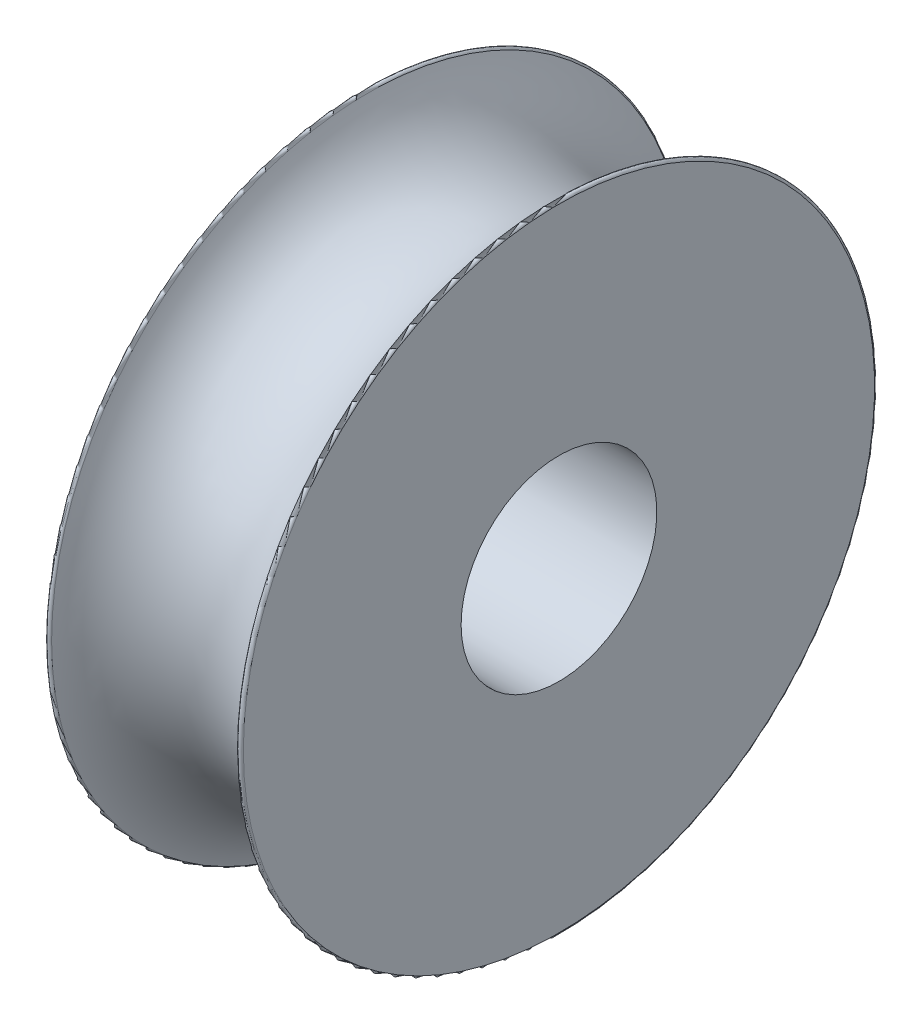
ISO-10303-21;
HEADER;
FILE_DESCRIPTION(('STEP AP214'),'2;1');
FILE_NAME('part.step','',(''),(''),'','','');
FILE_SCHEMA(('AUTOMOTIVE_DESIGN { 1 0 10303 214 1 1 1 1 }'));
ENDSEC;
DATA;
#1=APPLICATION_CONTEXT('core data for automotive mechanical design processes');
#2=APPLICATION_PROTOCOL_DEFINITION('international standard','automotive_design',2000,#1);
#3=PRODUCT_CONTEXT('',#1,'mechanical');
#4=PRODUCT('Part','Part','',(#3));
#5=PRODUCT_RELATED_PRODUCT_CATEGORY('part','',(#4));
#6=PRODUCT_DEFINITION_FORMATION('','',#4);
#7=PRODUCT_DEFINITION_CONTEXT('part definition',#1,'design');
#8=PRODUCT_DEFINITION('design','',#6,#7);
#9=PRODUCT_DEFINITION_SHAPE('','',#8);
#10=(LENGTH_UNIT() NAMED_UNIT(*) SI_UNIT(.MILLI.,.METRE.));
#11=(NAMED_UNIT(*) PLANE_ANGLE_UNIT() SI_UNIT($,.RADIAN.));
#12=(NAMED_UNIT(*) SI_UNIT($,.STERADIAN.) SOLID_ANGLE_UNIT());
#13=UNCERTAINTY_MEASURE_WITH_UNIT(LENGTH_MEASURE(1.E-05),#10,'distance_accuracy_value','');
#14=(GEOMETRIC_REPRESENTATION_CONTEXT(3) GLOBAL_UNCERTAINTY_ASSIGNED_CONTEXT((#13)) GLOBAL_UNIT_ASSIGNED_CONTEXT((#10,
#11,#12)) REPRESENTATION_CONTEXT('',''));
#15=CARTESIAN_POINT('',(0.,0.,0.));
#16=DIRECTION('',(0.,0.,1.));
#17=DIRECTION('',(1.,0.,0.));
#18=AXIS2_PLACEMENT_3D('',#15,#16,#17);
#19=CARTESIAN_POINT('',(0.,4.450390625,0.));
#20=DIRECTION('',(1.,0.,0.));
#21=DIRECTION('',(0.,0.,-1.));
#22=AXIS2_PLACEMENT_3D('',#19,#20,#21);
#23=PLANE('',#22);
#24=CARTESIAN_POINT('',(0.,-2.,0.));
#25=DIRECTION('',(-1.,0.,0.));
#26=DIRECTION('',(0.,0.,1.));
#27=AXIS2_PLACEMENT_3D('',#24,#25,#26);
#28=CIRCLE('',#27,2.);
#29=CARTESIAN_POINT('',(0.,-2.,2.));
#30=VERTEX_POINT('',#29);
#31=EDGE_CURVE('E10',#30,#30,#28,.T.);
#32=ORIENTED_EDGE('',*,*,#31,.F.);
#33=EDGE_LOOP('',(#32));
#34=FACE_BOUND('',#33,.T.);
#35=CARTESIAN_POINT('',(0.,-2.,0.));
#36=DIRECTION('',(-1.,0.,0.));
#37=DIRECTION('',(0.,0.,1.));
#38=AXIS2_PLACEMENT_3D('',#35,#36,#37);
#39=CIRCLE('',#38,6.450390625);
#40=CARTESIAN_POINT('',(0.,-2.,6.450390625));
#41=VERTEX_POINT('',#40);
#42=EDGE_CURVE('E66',#41,#41,#39,.T.);
#43=ORIENTED_EDGE('',*,*,#42,.T.);
#44=EDGE_LOOP('',(#43));
#45=FACE_BOUND('',#44,.T.);
#46=ADVANCED_FACE('F44',(#34,#45),#23,.F.);
#47=CARTESIAN_POINT('',(0.,-2.,0.));
#48=DIRECTION('',(-1.,0.,0.));
#49=DIRECTION('',(0.,0.,1.));
#50=AXIS2_PLACEMENT_3D('',#47,#48,#49);
#51=CYLINDRICAL_SURFACE('',#50,2.);
#52=CARTESIAN_POINT('',(4.,-2.,0.));
#53=DIRECTION('',(-1.,0.,0.));
#54=DIRECTION('',(0.,0.,1.));
#55=AXIS2_PLACEMENT_3D('',#52,#53,#54);
#56=CIRCLE('',#55,2.);
#57=CARTESIAN_POINT('',(4.,-2.,2.));
#58=VERTEX_POINT('',#57);
#59=EDGE_CURVE('E50',#58,#58,#56,.T.);
#60=ORIENTED_EDGE('',*,*,#59,.F.);
#61=EDGE_LOOP('',(#60));
#62=FACE_BOUND('',#61,.T.);
#63=ORIENTED_EDGE('',*,*,#31,.T.);
#64=EDGE_LOOP('',(#63));
#65=FACE_BOUND('',#64,.T.);
#66=ADVANCED_FACE('F91',(#62,#65),#51,.F.);
#67=CARTESIAN_POINT('',(4.,0.,0.));
#68=DIRECTION('',(-1.,0.,0.));
#69=DIRECTION('',(0.,0.,1.));
#70=AXIS2_PLACEMENT_3D('',#67,#68,#69);
#71=PLANE('',#70);
#72=CARTESIAN_POINT('',(4.,-2.,0.));
#73=DIRECTION('',(-1.,0.,0.));
#74=DIRECTION('',(0.,0.,1.));
#75=AXIS2_PLACEMENT_3D('',#72,#73,#74);
#76=CIRCLE('',#75,6.450390625);
#77=CARTESIAN_POINT('',(4.,-2.,6.450390625));
#78=VERTEX_POINT('',#77);
#79=EDGE_CURVE('E54',#78,#78,#76,.T.);
#80=ORIENTED_EDGE('',*,*,#79,.F.);
#81=EDGE_LOOP('',(#80));
#82=FACE_BOUND('',#81,.T.);
#83=ORIENTED_EDGE('',*,*,#59,.T.);
#84=EDGE_LOOP('',(#83));
#85=FACE_BOUND('',#84,.T.);
#86=ADVANCED_FACE('F86',(#82,#85),#71,.F.);
#87=CARTESIAN_POINT('',(3.950390625,-2.,0.));
#88=DIRECTION('',(-1.,0.,0.));
#89=DIRECTION('',(0.,0.,1.));
#90=AXIS2_PLACEMENT_3D('',#87,#88,#89);
#91=TOROIDAL_SURFACE('',#90,6.450390625,0.049609375);
#92=CARTESIAN_POINT('',(3.9031827711073,-2.,0.));
#93=DIRECTION('',(-1.,0.,0.));
#94=DIRECTION('',(0.,0.,1.));
#95=AXIS2_PLACEMENT_3D('',#92,#93,#94);
#96=CIRCLE('',#95,6.46563885829885);
#97=CARTESIAN_POINT('',(3.9031827711073,-2.,6.46563885829885));
#98=VERTEX_POINT('',#97);
#99=EDGE_CURVE('E58',#98,#98,#96,.T.);
#100=ORIENTED_EDGE('',*,*,#99,.F.);
#101=EDGE_LOOP('',(#100));
#102=FACE_BOUND('',#101,.T.);
#103=ORIENTED_EDGE('',*,*,#79,.T.);
#104=EDGE_LOOP('',(#103));
#105=FACE_BOUND('',#104,.T.);
#106=ADVANCED_FACE('F80',(#102,#105),#91,.T.);
#107=CARTESIAN_POINT('',(2.,-2.,0.));
#108=DIRECTION('',(-1.,0.,0.));
#109=DIRECTION('',(0.,0.,1.));
#110=AXIS2_PLACEMENT_3D('',#107,#108,#109);
#111=TOROIDAL_SURFACE('',#110,7.08037078341771,2.);
#112=CARTESIAN_POINT('',(0.0968172288927014,-2.,0.));
#113=DIRECTION('',(-1.,0.,0.));
#114=DIRECTION('',(0.,0.,1.));
#115=AXIS2_PLACEMENT_3D('',#112,#113,#114);
#116=CIRCLE('',#115,6.46563885829885);
#117=CARTESIAN_POINT('',(0.0968172288927014,-2.,6.46563885829885));
#118=VERTEX_POINT('',#117);
#119=EDGE_CURVE('E63',#118,#118,#116,.T.);
#120=ORIENTED_EDGE('',*,*,#119,.F.);
#121=EDGE_LOOP('',(#120));
#122=FACE_BOUND('',#121,.T.);
#123=ORIENTED_EDGE('',*,*,#99,.T.);
#124=EDGE_LOOP('',(#123));
#125=FACE_BOUND('',#124,.T.);
#126=ADVANCED_FACE('F74',(#122,#125),#111,.F.);
#127=CARTESIAN_POINT('',(0.0496093750000003,-2.,0.));
#128=DIRECTION('',(-1.,0.,0.));
#129=DIRECTION('',(0.,0.,1.));
#130=AXIS2_PLACEMENT_3D('',#127,#128,#129);
#131=TOROIDAL_SURFACE('',#130,6.450390625,0.0496093749999997);
#132=ORIENTED_EDGE('',*,*,#42,.F.);
#133=EDGE_LOOP('',(#132));
#134=FACE_BOUND('',#133,.T.);
#135=ORIENTED_EDGE('',*,*,#119,.T.);
#136=EDGE_LOOP('',(#135));
#137=FACE_BOUND('',#136,.T.);
#138=ADVANCED_FACE('F71',(#134,#137),#131,.T.);
#139=CLOSED_SHELL('',(#46,#66,#86,#106,#126,#138));
#140=MANIFOLD_SOLID_BREP('B2',#139);
#141=ADVANCED_BREP_SHAPE_REPRESENTATION('',(#18,#140),#14);
#142=SHAPE_DEFINITION_REPRESENTATION(#9,#141);
ENDSEC;
END-ISO-10303-21;
